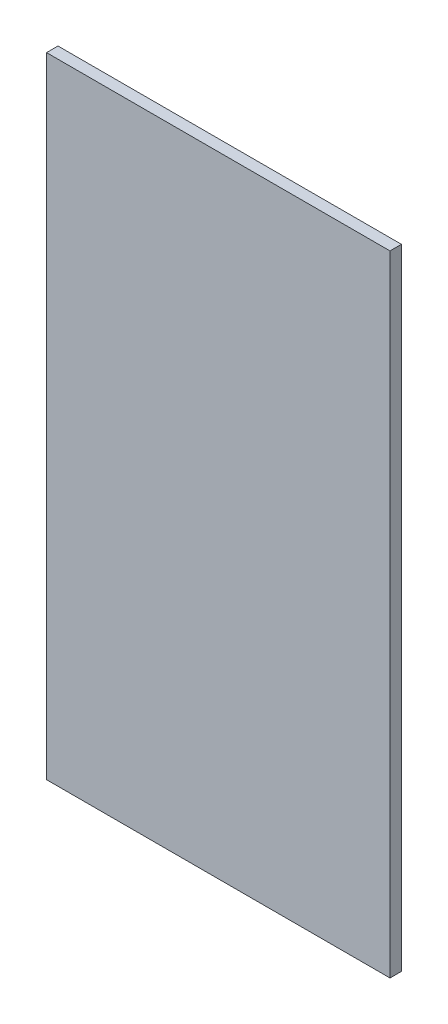
ISO-10303-21;
HEADER;
FILE_DESCRIPTION(('STEP AP214'),'2;1');
FILE_NAME('part.step','',(''),(''),'','','');
FILE_SCHEMA(('AUTOMOTIVE_DESIGN { 1 0 10303 214 1 1 1 1 }'));
ENDSEC;
DATA;
#1=APPLICATION_CONTEXT('core data for automotive mechanical design processes');
#2=APPLICATION_PROTOCOL_DEFINITION('international standard','automotive_design',2000,#1);
#3=PRODUCT_CONTEXT('',#1,'mechanical');
#4=PRODUCT('Part','Part','',(#3));
#5=PRODUCT_RELATED_PRODUCT_CATEGORY('part','',(#4));
#6=PRODUCT_DEFINITION_FORMATION('','',#4);
#7=PRODUCT_DEFINITION_CONTEXT('part definition',#1,'design');
#8=PRODUCT_DEFINITION('design','',#6,#7);
#9=PRODUCT_DEFINITION_SHAPE('','',#8);
#10=(LENGTH_UNIT() NAMED_UNIT(*) SI_UNIT(.MILLI.,.METRE.));
#11=(NAMED_UNIT(*) PLANE_ANGLE_UNIT() SI_UNIT($,.RADIAN.));
#12=(NAMED_UNIT(*) SI_UNIT($,.STERADIAN.) SOLID_ANGLE_UNIT());
#13=UNCERTAINTY_MEASURE_WITH_UNIT(LENGTH_MEASURE(1.E-05),#10,'distance_accuracy_value','');
#14=(GEOMETRIC_REPRESENTATION_CONTEXT(3) GLOBAL_UNCERTAINTY_ASSIGNED_CONTEXT((#13)) GLOBAL_UNIT_ASSIGNED_CONTEXT((#10,
#11,#12)) REPRESENTATION_CONTEXT('',''));
#15=CARTESIAN_POINT('',(0.,0.,0.));
#16=DIRECTION('',(0.,0.,1.));
#17=DIRECTION('',(1.,0.,0.));
#18=AXIS2_PLACEMENT_3D('',#15,#16,#17);
#19=CARTESIAN_POINT('',(0.,0.,10.));
#20=DIRECTION('',(1.,0.,0.));
#21=DIRECTION('',(0.,0.,-1.));
#22=AXIS2_PLACEMENT_3D('',#19,#20,#21);
#23=PLANE('',#22);
#24=DIRECTION('',(0.,-1.,0.));
#25=VECTOR('',#24,1.);
#26=CARTESIAN_POINT('',(0.,0.,0.));
#27=LINE('',#26,#25);
#28=CARTESIAN_POINT('',(0.,550.,0.));
#29=VERTEX_POINT('',#28);
#30=CARTESIAN_POINT('',(0.,0.,0.));
#31=VERTEX_POINT('',#30);
#32=EDGE_CURVE('E111',#29,#31,#27,.T.);
#33=ORIENTED_EDGE('',*,*,#32,.T.);
#34=DIRECTION('',(0.,0.,-1.));
#35=VECTOR('',#34,1.);
#36=CARTESIAN_POINT('',(0.,0.,10.));
#37=LINE('',#36,#35);
#38=CARTESIAN_POINT('',(0.,0.,10.));
#39=VERTEX_POINT('',#38);
#40=EDGE_CURVE('E11',#39,#31,#37,.T.);
#41=ORIENTED_EDGE('',*,*,#40,.F.);
#42=DIRECTION('',(0.,-1.,0.));
#43=VECTOR('',#42,1.);
#44=CARTESIAN_POINT('',(0.,0.,10.));
#45=LINE('',#44,#43);
#46=CARTESIAN_POINT('',(0.,550.,10.));
#47=VERTEX_POINT('',#46);
#48=EDGE_CURVE('E95',#47,#39,#45,.T.);
#49=ORIENTED_EDGE('',*,*,#48,.F.);
#50=DIRECTION('',(0.,0.,-1.));
#51=VECTOR('',#50,1.);
#52=CARTESIAN_POINT('',(0.,550.,10.));
#53=LINE('',#52,#51);
#54=EDGE_CURVE('E107',#47,#29,#53,.T.);
#55=ORIENTED_EDGE('',*,*,#54,.T.);
#56=EDGE_LOOP('',(#33,#41,#49,#55));
#57=FACE_BOUND('',#56,.T.);
#58=ADVANCED_FACE('F43',(#57),#23,.F.);
#59=CARTESIAN_POINT('',(0.,0.,10.));
#60=DIRECTION('',(0.,1.,0.));
#61=DIRECTION('',(0.,0.,1.));
#62=AXIS2_PLACEMENT_3D('',#59,#60,#61);
#63=PLANE('',#62);
#64=DIRECTION('',(1.,0.,0.));
#65=VECTOR('',#64,1.);
#66=CARTESIAN_POINT('',(0.,0.,0.));
#67=LINE('',#66,#65);
#68=CARTESIAN_POINT('',(300.,0.,0.));
#69=VERTEX_POINT('',#68);
#70=EDGE_CURVE('E100',#31,#69,#67,.T.);
#71=ORIENTED_EDGE('',*,*,#70,.T.);
#72=DIRECTION('',(0.,0.,-1.));
#73=VECTOR('',#72,1.);
#74=CARTESIAN_POINT('',(300.,0.,10.));
#75=LINE('',#74,#73);
#76=CARTESIAN_POINT('',(300.,0.,10.));
#77=VERTEX_POINT('',#76);
#78=EDGE_CURVE('E52',#77,#69,#75,.T.);
#79=ORIENTED_EDGE('',*,*,#78,.F.);
#80=DIRECTION('',(1.,0.,0.));
#81=VECTOR('',#80,1.);
#82=CARTESIAN_POINT('',(0.,0.,10.));
#83=LINE('',#82,#81);
#84=EDGE_CURVE('E90',#39,#77,#83,.T.);
#85=ORIENTED_EDGE('',*,*,#84,.F.);
#86=ORIENTED_EDGE('',*,*,#40,.T.);
#87=EDGE_LOOP('',(#71,#79,#85,#86));
#88=FACE_BOUND('',#87,.T.);
#89=ADVANCED_FACE('F99',(#88),#63,.F.);
#90=CARTESIAN_POINT('',(300.,0.,10.));
#91=DIRECTION('',(-1.,0.,0.));
#92=DIRECTION('',(0.,0.,1.));
#93=AXIS2_PLACEMENT_3D('',#90,#91,#92);
#94=PLANE('',#93);
#95=DIRECTION('',(0.,1.,0.));
#96=VECTOR('',#95,1.);
#97=CARTESIAN_POINT('',(300.,0.,0.));
#98=LINE('',#97,#96);
#99=CARTESIAN_POINT('',(300.,550.,0.));
#100=VERTEX_POINT('',#99);
#101=EDGE_CURVE('E77',#69,#100,#98,.T.);
#102=ORIENTED_EDGE('',*,*,#101,.T.);
#103=DIRECTION('',(0.,0.,-1.));
#104=VECTOR('',#103,1.);
#105=CARTESIAN_POINT('',(300.,550.,10.));
#106=LINE('',#105,#104);
#107=CARTESIAN_POINT('',(300.,550.,10.));
#108=VERTEX_POINT('',#107);
#109=EDGE_CURVE('E102',#108,#100,#106,.T.);
#110=ORIENTED_EDGE('',*,*,#109,.F.);
#111=DIRECTION('',(0.,1.,0.));
#112=VECTOR('',#111,1.);
#113=CARTESIAN_POINT('',(300.,0.,10.));
#114=LINE('',#113,#112);
#115=EDGE_CURVE('E93',#77,#108,#114,.T.);
#116=ORIENTED_EDGE('',*,*,#115,.F.);
#117=ORIENTED_EDGE('',*,*,#78,.T.);
#118=EDGE_LOOP('',(#102,#110,#116,#117));
#119=FACE_BOUND('',#118,.T.);
#120=ADVANCED_FACE('F103',(#119),#94,.F.);
#121=CARTESIAN_POINT('',(0.,550.,10.));
#122=DIRECTION('',(0.,-1.,0.));
#123=DIRECTION('',(0.,0.,-1.));
#124=AXIS2_PLACEMENT_3D('',#121,#122,#123);
#125=PLANE('',#124);
#126=DIRECTION('',(-1.,0.,0.));
#127=VECTOR('',#126,1.);
#128=CARTESIAN_POINT('',(0.,550.,0.));
#129=LINE('',#128,#127);
#130=EDGE_CURVE('E83',#100,#29,#129,.T.);
#131=ORIENTED_EDGE('',*,*,#130,.T.);
#132=ORIENTED_EDGE('',*,*,#54,.F.);
#133=DIRECTION('',(-1.,0.,0.));
#134=VECTOR('',#133,1.);
#135=CARTESIAN_POINT('',(0.,550.,10.));
#136=LINE('',#135,#134);
#137=EDGE_CURVE('E60',#108,#47,#136,.T.);
#138=ORIENTED_EDGE('',*,*,#137,.F.);
#139=ORIENTED_EDGE('',*,*,#109,.T.);
#140=EDGE_LOOP('',(#131,#132,#138,#139));
#141=FACE_BOUND('',#140,.T.);
#142=ADVANCED_FACE('F124',(#141),#125,.F.);
#143=CARTESIAN_POINT('',(0.,0.,10.));
#144=DIRECTION('',(0.,0.,-1.));
#145=DIRECTION('',(-1.,0.,0.));
#146=AXIS2_PLACEMENT_3D('',#143,#144,#145);
#147=PLANE('',#146);
#148=ORIENTED_EDGE('',*,*,#48,.T.);
#149=ORIENTED_EDGE('',*,*,#84,.T.);
#150=ORIENTED_EDGE('',*,*,#115,.T.);
#151=ORIENTED_EDGE('',*,*,#137,.T.);
#152=EDGE_LOOP('',(#148,#149,#150,#151));
#153=FACE_BOUND('',#152,.T.);
#154=ADVANCED_FACE('F91',(#153),#147,.F.);
#155=CARTESIAN_POINT('',(0.,0.,0.));
#156=DIRECTION('',(0.,0.,-1.));
#157=DIRECTION('',(-1.,0.,0.));
#158=AXIS2_PLACEMENT_3D('',#155,#156,#157);
#159=PLANE('',#158);
#160=ORIENTED_EDGE('',*,*,#32,.F.);
#161=ORIENTED_EDGE('',*,*,#130,.F.);
#162=ORIENTED_EDGE('',*,*,#101,.F.);
#163=ORIENTED_EDGE('',*,*,#70,.F.);
#164=EDGE_LOOP('',(#160,#161,#162,#163));
#165=FACE_BOUND('',#164,.T.);
#166=ADVANCED_FACE('F127',(#165),#159,.T.);
#167=CLOSED_SHELL('',(#58,#89,#120,#142,#154,#166));
#168=MANIFOLD_SOLID_BREP('B2',#167);
#169=ADVANCED_BREP_SHAPE_REPRESENTATION('',(#18,#168),#14);
#170=SHAPE_DEFINITION_REPRESENTATION(#9,#169);
ENDSEC;
END-ISO-10303-21;
